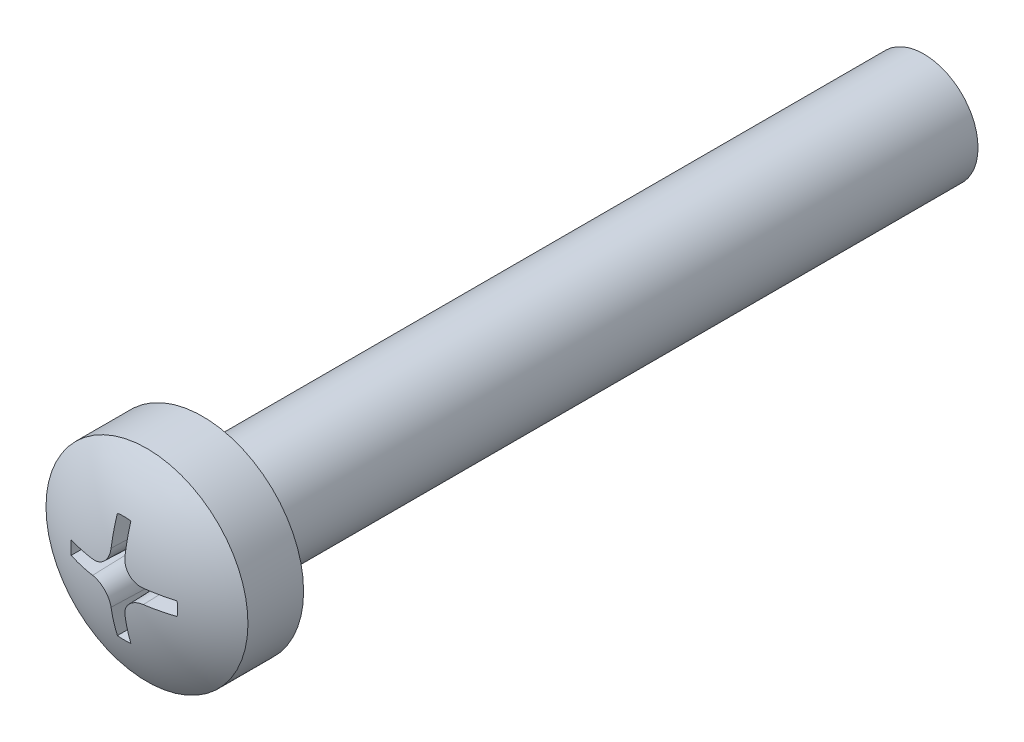
ISO-10303-21;
HEADER;
FILE_DESCRIPTION(('STEP AP214'),'2;1');
FILE_NAME('part.step','',(''),(''),'','','');
FILE_SCHEMA(('AUTOMOTIVE_DESIGN { 1 0 10303 214 1 1 1 1 }'));
ENDSEC;
DATA;
#1=APPLICATION_CONTEXT('core data for automotive mechanical design processes');
#2=APPLICATION_PROTOCOL_DEFINITION('international standard','automotive_design',2000,#1);
#3=PRODUCT_CONTEXT('',#1,'mechanical');
#4=PRODUCT('Part','Part','',(#3));
#5=PRODUCT_RELATED_PRODUCT_CATEGORY('part','',(#4));
#6=PRODUCT_DEFINITION_FORMATION('','',#4);
#7=PRODUCT_DEFINITION_CONTEXT('part definition',#1,'design');
#8=PRODUCT_DEFINITION('design','',#6,#7);
#9=PRODUCT_DEFINITION_SHAPE('','',#8);
#10=(LENGTH_UNIT() NAMED_UNIT(*) SI_UNIT(.MILLI.,.METRE.));
#11=(NAMED_UNIT(*) PLANE_ANGLE_UNIT() SI_UNIT($,.RADIAN.));
#12=(NAMED_UNIT(*) SI_UNIT($,.STERADIAN.) SOLID_ANGLE_UNIT());
#13=UNCERTAINTY_MEASURE_WITH_UNIT(LENGTH_MEASURE(1.E-05),#10,'distance_accuracy_value','');
#14=(GEOMETRIC_REPRESENTATION_CONTEXT(3) GLOBAL_UNCERTAINTY_ASSIGNED_CONTEXT((#13)) GLOBAL_UNIT_ASSIGNED_CONTEXT((#10,
#11,#12)) REPRESENTATION_CONTEXT('',''));
#15=CARTESIAN_POINT('',(0.,0.,0.));
#16=DIRECTION('',(0.,0.,1.));
#17=DIRECTION('',(1.,0.,0.));
#18=AXIS2_PLACEMENT_3D('',#15,#16,#17);
#19=CARTESIAN_POINT('',(0.,0.,20.));
#20=DIRECTION('',(0.,0.,-1.));
#21=DIRECTION('',(-1.,0.,0.));
#22=AXIS2_PLACEMENT_3D('',#19,#20,#21);
#23=CYLINDRICAL_SURFACE('',#22,1.5);
#24=CARTESIAN_POINT('',(0.,0.,20.));
#25=DIRECTION('',(0.,0.,1.));
#26=DIRECTION('',(1.,0.,0.));
#27=AXIS2_PLACEMENT_3D('',#24,#25,#26);
#28=CIRCLE('',#27,1.5);
#29=CARTESIAN_POINT('',(1.5,0.,20.));
#30=VERTEX_POINT('',#29);
#31=EDGE_CURVE('E206',#30,#30,#28,.T.);
#32=ORIENTED_EDGE('',*,*,#31,.F.);
#33=EDGE_LOOP('',(#32));
#34=FACE_BOUND('',#33,.T.);
#35=CARTESIAN_POINT('',(0.,0.,0.));
#36=DIRECTION('',(0.,0.,1.));
#37=DIRECTION('',(1.,0.,0.));
#38=AXIS2_PLACEMENT_3D('',#35,#36,#37);
#39=CIRCLE('',#38,1.5);
#40=CARTESIAN_POINT('',(1.5,0.,0.));
#41=VERTEX_POINT('',#40);
#42=EDGE_CURVE('E205',#41,#41,#39,.T.);
#43=ORIENTED_EDGE('',*,*,#42,.T.);
#44=EDGE_LOOP('',(#43));
#45=FACE_BOUND('',#44,.T.);
#46=ADVANCED_FACE('F34',(#34,#45),#23,.T.);
#47=CARTESIAN_POINT('',(0.,0.,0.));
#48=DIRECTION('',(0.,0.,1.));
#49=DIRECTION('',(1.,0.,0.));
#50=AXIS2_PLACEMENT_3D('',#47,#48,#49);
#51=PLANE('',#50);
#52=ORIENTED_EDGE('',*,*,#42,.F.);
#53=EDGE_LOOP('',(#52));
#54=FACE_BOUND('',#53,.T.);
#55=ADVANCED_FACE('F295',(#54),#51,.F.);
#56=CARTESIAN_POINT('',(0.,0.,20.));
#57=DIRECTION('',(0.,0.,-1.));
#58=DIRECTION('',(-1.,0.,0.));
#59=AXIS2_PLACEMENT_3D('',#56,#57,#58);
#60=PLANE('',#59);
#61=CARTESIAN_POINT('',(0.,0.,20.));
#62=DIRECTION('',(0.,0.,-1.));
#63=DIRECTION('',(-1.,0.,0.));
#64=AXIS2_PLACEMENT_3D('',#61,#62,#63);
#65=CIRCLE('',#64,2.79999990016222);
#66=CARTESIAN_POINT('',(-2.79999990016222,0.,20.));
#67=VERTEX_POINT('',#66);
#68=EDGE_CURVE('E202',#67,#67,#65,.T.);
#69=ORIENTED_EDGE('',*,*,#68,.T.);
#70=EDGE_LOOP('',(#69));
#71=FACE_BOUND('',#70,.T.);
#72=ORIENTED_EDGE('',*,*,#31,.T.);
#73=EDGE_LOOP('',(#72));
#74=FACE_BOUND('',#73,.T.);
#75=ADVANCED_FACE('F300',(#71,#74),#60,.T.);
#76=CARTESIAN_POINT('',(0.,0.,-0.393620134621003));
#77=DIRECTION('',(0.,0.,-1.));
#78=DIRECTION('',(-1.,0.,0.));
#79=AXIS2_PLACEMENT_3D('',#76,#77,#78);
#80=CYLINDRICAL_SURFACE('',#79,2.79999990016222);
#81=CARTESIAN_POINT('',(0.,0.,21.5424630797893));
#82=DIRECTION('',(0.,0.,-1.));
#83=DIRECTION('',(-1.,0.,0.));
#84=AXIS2_PLACEMENT_3D('',#81,#82,#83);
#85=CIRCLE('',#84,2.79999990016222);
#86=CARTESIAN_POINT('',(-2.79999990016222,0.,21.5424630797893));
#87=VERTEX_POINT('',#86);
#88=EDGE_CURVE('E150',#87,#87,#85,.T.);
#89=ORIENTED_EDGE('',*,*,#88,.T.);
#90=EDGE_LOOP('',(#89));
#91=FACE_BOUND('',#90,.T.);
#92=ORIENTED_EDGE('',*,*,#68,.F.);
#93=EDGE_LOOP('',(#92));
#94=FACE_BOUND('',#93,.T.);
#95=ADVANCED_FACE('F307',(#91,#94),#80,.T.);
#96=CARTESIAN_POINT('',(0.,0.,17.4000001117587));
#97=DIRECTION('',(0.,0.,-1.));
#98=DIRECTION('',(1.,0.,0.));
#99=AXIS2_PLACEMENT_3D('',#96,#97,#98);
#100=SPHERICAL_SURFACE('',#99,4.99999988824129);
#101=CARTESIAN_POINT('',(0.,0.,22.1754183821502));
#102=DIRECTION('',(0.,0.,-1.));
#103=DIRECTION('',(-1.,0.,0.));
#104=AXIS2_PLACEMENT_3D('',#101,#102,#103);
#105=CIRCLE('',#104,1.4816812157899);
#106=CARTESIAN_POINT('',(0.18668120666759,1.46987392394782,22.1754183821501));
#107=VERTEX_POINT('',#106);
#108=CARTESIAN_POINT('',(-0.186681206667593,1.46987392394782,22.1754183821501));
#109=VERTEX_POINT('',#108);
#110=EDGE_CURVE('E11',#107,#109,#105,.F.);
#111=ORIENTED_EDGE('',*,*,#110,.F.);
#112=CARTESIAN_POINT('',(0.0198956640512633,0.,17.3993053398605));
#113=DIRECTION('',(0.999390827019096,0.,-0.034899496702501));
#114=DIRECTION('',(-0.034899496702501,0.,-0.999390827019096));
#115=AXIS2_PLACEMENT_3D('',#112,#113,#114);
#116=CIRCLE('',#115,4.99996025606773);
#117=CARTESIAN_POINT('',(0.192632610704328,0.708178557647151,22.3458442955351));
#118=VERTEX_POINT('',#117);
#119=EDGE_CURVE('E41',#107,#118,#116,.T.);
#120=ORIENTED_EDGE('',*,*,#119,.T.);
#121=CARTESIAN_POINT('',(0.192631650862954,0.708378557647151,22.345815691475));
#122=CARTESIAN_POINT('',(0.192737639690806,0.679822741796073,22.3499041439734));
#123=CARTESIAN_POINT('',(0.195268867839181,0.651227392830895,22.3536463362414));
#124=CARTESIAN_POINT('',(0.205046889209158,0.594767038274589,22.3603460551712));
#125=CARTESIAN_POINT('',(0.212292618678018,0.566901869404939,22.3633037586285));
#126=CARTESIAN_POINT('',(0.231373694375068,0.51267267841366,22.3683466063254));
#127=CARTESIAN_POINT('',(0.24321326807329,0.486310064716558,22.3704309431667));
#128=CARTESIAN_POINT('',(0.271156607880554,0.435900324544808,22.3736603491012));
#129=CARTESIAN_POINT('',(0.287258672100205,0.411852279143785,22.3748057923214));
#130=CARTESIAN_POINT('',(0.323072075489886,0.367028886470805,22.3761158025717));
#131=CARTESIAN_POINT('',(0.342740648168189,0.346219679514824,22.3762912893596));
#132=CARTESIAN_POINT('',(0.385246757538769,0.308146709447779,22.3756853456951));
#133=CARTESIAN_POINT('',(0.408084792807393,0.29088350520688,22.3749037645383));
#134=CARTESIAN_POINT('',(0.456147210008962,0.260464262414973,22.3724133951705));
#135=CARTESIAN_POINT('',(0.481359759209806,0.247289131136678,22.3707090224733));
#136=CARTESIAN_POINT('',(0.533541444049375,0.225283958921734,22.3664258870809));
#137=CARTESIAN_POINT('',(0.560509920861878,0.216452298826715,22.3638474508254));
#138=CARTESIAN_POINT('',(0.606876295057339,0.205379627868596,22.3588207651558));
#139=CARTESIAN_POINT('',(0.626020977094075,0.201943221890058,22.3565812960749));
#140=CARTESIAN_POINT('',(0.664502044043211,0.197253494550335,22.3517582366185));
#141=CARTESIAN_POINT('',(0.683838077649067,0.195996727127303,22.349175196413));
#142=CARTESIAN_POINT('',(0.703167546290468,0.195835015722444,22.3464334662955));
#143=B_SPLINE_CURVE_WITH_KNOTS('',3,(#121,#122,#123,#124,#125,#126,#127,#128,#129,#130,#131,
#132,#133,#134,#135,#136,#137,#138,#139,#140,#141,#142),.UNSPECIFIED.,.F.,.F.,(4,2,2,2,2,2,2,2,
2,2,4),(0.,0.086441782958675,0.172864068455127,0.259366073122685,0.34583359199461,
0.43132564691208,0.516831165542018,0.601931114274005,0.686999315371812,0.745618262708563,
0.804144447281415),.UNSPECIFIED.);
#144=CARTESIAN_POINT('',(0.702917362553185,0.19583721033533,22.3464689381926));
#145=VERTEX_POINT('',#144);
#146=EDGE_CURVE('E277',#118,#145,#143,.T.);
#147=ORIENTED_EDGE('',*,*,#146,.T.);
#148=CARTESIAN_POINT('',(0.000105390153351674,0.0259265633149154,17.3990947287374));
#149=DIRECTION('',(0.00406243901494415,0.999382570249833,-0.034899496702501));
#150=DIRECTION('',(0.,0.0348997846864301,0.999390816962434));
#151=AXIS2_PLACEMENT_3D('',#148,#149,#150);
#152=CIRCLE('',#151,4.99993258603575);
#153=CARTESIAN_POINT('',(1.46986565043204,0.186746338396853,22.1754183821502));
#154=VERTEX_POINT('',#153);
#155=EDGE_CURVE('E275',#154,#145,#152,.F.);
#156=ORIENTED_EDGE('',*,*,#155,.F.);
#157=CARTESIAN_POINT('',(0.,0.,22.1754183821502));
#158=DIRECTION('',(0.,0.,-1.));
#159=DIRECTION('',(-1.,0.,0.));
#160=AXIS2_PLACEMENT_3D('',#157,#158,#159);
#161=CIRCLE('',#160,1.4816812157899);
#162=CARTESIAN_POINT('',(1.46986565043204,-0.186746338396852,22.1754183821501));
#163=VERTEX_POINT('',#162);
#164=EDGE_CURVE('E273',#163,#154,#161,.F.);
#165=ORIENTED_EDGE('',*,*,#164,.F.);
#166=CARTESIAN_POINT('',(0.000105390153351705,-0.0259265633149168,17.3990947287374));
#167=DIRECTION('',(0.00406243901494512,-0.999382570249833,-0.034899496702501));
#168=DIRECTION('',(0.,0.0348997846864301,-0.999390816962434));
#169=AXIS2_PLACEMENT_3D('',#166,#167,#168);
#170=CIRCLE('',#169,4.99993258603575);
#171=CARTESIAN_POINT('',(0.702917362553185,-0.195837210335333,22.3464689381926));
#172=VERTEX_POINT('',#171);
#173=EDGE_CURVE('E270',#163,#172,#170,.T.);
#174=ORIENTED_EDGE('',*,*,#173,.T.);
#175=CARTESIAN_POINT('',(0.192631650862954,-0.708378557647151,22.345815691475));
#176=CARTESIAN_POINT('',(0.192737639690806,-0.679822741796074,22.3499041439734));
#177=CARTESIAN_POINT('',(0.195268867839181,-0.651227392830896,22.3536463362414));
#178=CARTESIAN_POINT('',(0.205046889209158,-0.59476703827459,22.3603460551712));
#179=CARTESIAN_POINT('',(0.212292618678018,-0.56690186940494,22.3633037586285));
#180=CARTESIAN_POINT('',(0.231373694375068,-0.512672678413661,22.3683466063254));
#181=CARTESIAN_POINT('',(0.24321326807329,-0.486310064716559,22.3704309431667));
#182=CARTESIAN_POINT('',(0.271156607880554,-0.435900324544809,22.3736603491012));
#183=CARTESIAN_POINT('',(0.287258672100205,-0.411852279143786,22.3748057923214));
#184=CARTESIAN_POINT('',(0.323072075489886,-0.367028886470806,22.3761158025717));
#185=CARTESIAN_POINT('',(0.342740648168188,-0.346219679514826,22.3762912893596));
#186=CARTESIAN_POINT('',(0.385246757538768,-0.30814670944778,22.3756853456951));
#187=CARTESIAN_POINT('',(0.408084792807392,-0.290883505206882,22.3749037645383));
#188=CARTESIAN_POINT('',(0.456147210008962,-0.260464262414974,22.3724133951705));
#189=CARTESIAN_POINT('',(0.481359759209806,-0.247289131136679,22.3707090224733));
#190=CARTESIAN_POINT('',(0.533541444049374,-0.225283958921735,22.3664258870809));
#191=CARTESIAN_POINT('',(0.560509920861878,-0.216452298826716,22.3638474508254));
#192=CARTESIAN_POINT('',(0.606876295057339,-0.205379627868597,22.3588207651558));
#193=CARTESIAN_POINT('',(0.626020977094074,-0.201943221890059,22.3565812960749));
#194=CARTESIAN_POINT('',(0.66450204404321,-0.197253494550336,22.3517582366185));
#195=CARTESIAN_POINT('',(0.683838077649067,-0.195996727127304,22.349175196413));
#196=CARTESIAN_POINT('',(0.703167546290468,-0.195835015722445,22.3464334662955));
#197=B_SPLINE_CURVE_WITH_KNOTS('',3,(#175,#176,#177,#178,#179,#180,#181,#182,#183,#184,#185,
#186,#187,#188,#189,#190,#191,#192,#193,#194,#195,#196),.UNSPECIFIED.,.F.,.F.,(4,2,2,2,2,2,2,2,
2,2,4),(0.,0.0864417829586748,0.172864068455127,0.259366073122684,0.34583359199461,
0.43132564691208,0.516831165542017,0.601931114274005,0.686999315371811,0.745618262708562,
0.804144447281415),.UNSPECIFIED.);
#198=CARTESIAN_POINT('',(0.192632610704328,-0.708178557647152,22.3458442955351));
#199=VERTEX_POINT('',#198);
#200=EDGE_CURVE('E264',#199,#172,#197,.T.);
#201=ORIENTED_EDGE('',*,*,#200,.F.);
#202=CARTESIAN_POINT('',(0.0198956640512633,0.,17.3993053398605));
#203=DIRECTION('',(0.999390827019096,0.,-0.034899496702501));
#204=DIRECTION('',(-0.034899496702501,0.,-0.999390827019096));
#205=AXIS2_PLACEMENT_3D('',#202,#203,#204);
#206=CIRCLE('',#205,4.99996025606773);
#207=CARTESIAN_POINT('',(0.186681206667591,-1.46987392394782,22.1754183821502));
#208=VERTEX_POINT('',#207);
#209=EDGE_CURVE('E262',#208,#199,#206,.F.);
#210=ORIENTED_EDGE('',*,*,#209,.F.);
#211=CARTESIAN_POINT('',(0.,0.,22.1754183821502));
#212=DIRECTION('',(0.,0.,-1.));
#213=DIRECTION('',(-1.,0.,0.));
#214=AXIS2_PLACEMENT_3D('',#211,#212,#213);
#215=CIRCLE('',#214,1.4816812157899);
#216=CARTESIAN_POINT('',(-0.186681206667593,-1.46987392394782,22.1754183821501));
#217=VERTEX_POINT('',#216);
#218=EDGE_CURVE('E259',#208,#217,#215,.T.);
#219=ORIENTED_EDGE('',*,*,#218,.T.);
#220=CARTESIAN_POINT('',(-0.0198956640512654,0.,17.3993053398605));
#221=DIRECTION('',(-0.999390827019096,0.,-0.034899496702501));
#222=DIRECTION('',(-0.034899496702501,0.,0.999390827019096));
#223=AXIS2_PLACEMENT_3D('',#220,#221,#222);
#224=CIRCLE('',#223,4.99996025606773);
#225=CARTESIAN_POINT('',(-0.19263261070433,-0.708178557647151,22.3458442955351));
#226=VERTEX_POINT('',#225);
#227=EDGE_CURVE('E255',#217,#226,#224,.T.);
#228=ORIENTED_EDGE('',*,*,#227,.T.);
#229=CARTESIAN_POINT('',(-0.70316754629047,-0.195835015722445,22.3464334662955));
#230=CARTESIAN_POINT('',(-0.674619447950853,-0.196052963217916,22.3504857241647));
#231=CARTESIAN_POINT('',(-0.646041434637229,-0.198695168407334,22.3541890416191));
#232=CARTESIAN_POINT('',(-0.589634494727846,-0.208689654905481,22.3608068014756));
#233=CARTESIAN_POINT('',(-0.561805393198953,-0.216040826152062,22.3637214295682));
#234=CARTESIAN_POINT('',(-0.507666120821231,-0.235323893103951,22.3686750861046));
#235=CARTESIAN_POINT('',(-0.481357369172765,-0.247259991703852,22.370713307523));
#236=CARTESIAN_POINT('',(-0.431071022991569,-0.275383990623326,22.3738489099634));
#237=CARTESIAN_POINT('',(-0.407092510169896,-0.291570206692358,22.3749466629444));
#238=CARTESIAN_POINT('',(-0.362416703115868,-0.327538701485094,22.3761618083202));
#239=CARTESIAN_POINT('',(-0.341685887352751,-0.347278991317758,22.376289966384));
#240=CARTESIAN_POINT('',(-0.303780328011578,-0.389912448398921,22.375590364716));
#241=CARTESIAN_POINT('',(-0.286606147147997,-0.412806113607387,22.3747624538554));
#242=CARTESIAN_POINT('',(-0.256366858084051,-0.460969475916928,22.3721816258056));
#243=CARTESIAN_POINT('',(-0.243283863198687,-0.486228184526671,22.3704328274806));
#244=CARTESIAN_POINT('',(-0.22146899790456,-0.538485231439467,22.366063898297));
#245=CARTESIAN_POINT('',(-0.212735526227358,-0.565482925398503,22.3634440886927));
#246=CARTESIAN_POINT('',(-0.201823996880683,-0.611913615273529,22.3583478129874));
#247=CARTESIAN_POINT('',(-0.198453223120025,-0.631098599357624,22.3560784464194));
#248=CARTESIAN_POINT('',(-0.193901764340931,-0.669652448873598,22.3511968730386));
#249=CARTESIAN_POINT('',(-0.192717622166764,-0.689020975292662,22.3485852144187));
#250=CARTESIAN_POINT('',(-0.192631650862956,-0.708378557647151,22.345815691475));
#251=B_SPLINE_CURVE_WITH_KNOTS('',3,(#229,#230,#231,#232,#233,#234,#235,#236,#237,#238,#239,
#240,#241,#242,#243,#244,#245,#246,#247,#248,#249,#250),.UNSPECIFIED.,.F.,.F.,(4,2,2,2,2,2,2,2,
2,2,4),(0.,0.0864053436114192,0.172790326060609,0.259254685287908,0.345684831711329,
0.431153892876566,0.516636466251359,0.601739908197795,0.686811996276176,0.745524819849981,
0.804144736260156),.UNSPECIFIED.);
#252=CARTESIAN_POINT('',(-0.702917362553187,-0.195837210335331,22.3464689381926));
#253=VERTEX_POINT('',#252);
#254=EDGE_CURVE('E248',#253,#226,#251,.T.);
#255=ORIENTED_EDGE('',*,*,#254,.F.);
#256=CARTESIAN_POINT('',(-0.000105390153348331,-0.0259265633149167,17.3990947287374));
#257=DIRECTION('',(-0.0040624390149453,-0.999382570249833,-0.034899496702501));
#258=DIRECTION('',(0.,0.0348997846864301,-0.999390816962434));
#259=AXIS2_PLACEMENT_3D('',#256,#257,#258);
#260=CIRCLE('',#259,4.99993258603575);
#261=CARTESIAN_POINT('',(-1.46986565043204,-0.186746338396853,22.1754183821502));
#262=VERTEX_POINT('',#261);
#263=EDGE_CURVE('E256',#262,#253,#260,.F.);
#264=ORIENTED_EDGE('',*,*,#263,.F.);
#265=CARTESIAN_POINT('',(0.,0.,22.1754183821502));
#266=DIRECTION('',(0.,0.,-1.));
#267=DIRECTION('',(-1.,0.,0.));
#268=AXIS2_PLACEMENT_3D('',#265,#266,#267);
#269=CIRCLE('',#268,1.4816812157899);
#270=CARTESIAN_POINT('',(-1.46986565043204,0.186746338396852,22.1754183821501));
#271=VERTEX_POINT('',#270);
#272=EDGE_CURVE('E594',#262,#271,#269,.T.);
#273=ORIENTED_EDGE('',*,*,#272,.T.);
#274=CARTESIAN_POINT('',(-0.000105390153348331,0.0259265633149167,17.3990947287374));
#275=DIRECTION('',(-0.00406243901494529,0.999382570249833,-0.034899496702501));
#276=DIRECTION('',(0.,0.0348997846864301,0.999390816962434));
#277=AXIS2_PLACEMENT_3D('',#274,#275,#276);
#278=CIRCLE('',#277,4.99993258603575);
#279=CARTESIAN_POINT('',(-0.702917362553187,0.195837210335332,22.3464689381926));
#280=VERTEX_POINT('',#279);
#281=EDGE_CURVE('E221',#271,#280,#278,.T.);
#282=ORIENTED_EDGE('',*,*,#281,.T.);
#283=CARTESIAN_POINT('',(-0.192631650862955,0.708378557647151,22.345815691475));
#284=CARTESIAN_POINT('',(-0.192737639690808,0.679822741796073,22.3499041439734));
#285=CARTESIAN_POINT('',(-0.195268867839183,0.651227392830895,22.3536463362414));
#286=CARTESIAN_POINT('',(-0.20504688920916,0.594767038274589,22.3603460551712));
#287=CARTESIAN_POINT('',(-0.21229261867802,0.566901869404939,22.3633037586285));
#288=CARTESIAN_POINT('',(-0.23137369437507,0.51267267841366,22.3683466063254));
#289=CARTESIAN_POINT('',(-0.243213268073292,0.486310064716558,22.3704309431667));
#290=CARTESIAN_POINT('',(-0.271156607880556,0.435900324544808,22.3736603491012));
#291=CARTESIAN_POINT('',(-0.287258672100207,0.411852279143785,22.3748057923214));
#292=CARTESIAN_POINT('',(-0.323072075489888,0.367028886470805,22.3761158025717));
#293=CARTESIAN_POINT('',(-0.34274064816819,0.346219679514825,22.3762912893596));
#294=CARTESIAN_POINT('',(-0.38524675753877,0.30814670944778,22.3756853456951));
#295=CARTESIAN_POINT('',(-0.408084792807394,0.290883505206881,22.3749037645383));
#296=CARTESIAN_POINT('',(-0.456147210008964,0.260464262414973,22.3724133951705));
#297=CARTESIAN_POINT('',(-0.481359759209807,0.247289131136679,22.3707090224733));
#298=CARTESIAN_POINT('',(-0.533541444049376,0.225283958921734,22.3664258870809));
#299=CARTESIAN_POINT('',(-0.56050992086188,0.216452298826715,22.3638474508254));
#300=CARTESIAN_POINT('',(-0.606876295057341,0.205379627868597,22.3588207651558));
#301=CARTESIAN_POINT('',(-0.626020977094076,0.201943221890059,22.3565812960749));
#302=CARTESIAN_POINT('',(-0.664502044043212,0.197253494550336,22.3517582366185));
#303=CARTESIAN_POINT('',(-0.683838077649069,0.195996727127304,22.349175196413));
#304=CARTESIAN_POINT('',(-0.703167546290469,0.195835015722445,22.3464334662955));
#305=B_SPLINE_CURVE_WITH_KNOTS('',3,(#283,#284,#285,#286,#287,#288,#289,#290,#291,#292,#293,
#294,#295,#296,#297,#298,#299,#300,#301,#302,#303,#304),.UNSPECIFIED.,.F.,.F.,(4,2,2,2,2,2,2,2,
2,2,4),(0.,0.0864417829586747,0.172864068455127,0.259366073122685,0.34583359199461,
0.43132564691208,0.516831165542017,0.601931114274005,0.686999315371811,0.745618262708562,
0.804144447281415),.UNSPECIFIED.);
#306=CARTESIAN_POINT('',(-0.19263261070433,0.708178557647151,22.3458442955351));
#307=VERTEX_POINT('',#306);
#308=EDGE_CURVE('E213',#307,#280,#305,.T.);
#309=ORIENTED_EDGE('',*,*,#308,.F.);
#310=CARTESIAN_POINT('',(-0.0198956640512643,0.,17.3993053398605));
#311=DIRECTION('',(-0.999390827019096,0.,-0.034899496702501));
#312=DIRECTION('',(-0.034899496702501,0.,0.999390827019096));
#313=AXIS2_PLACEMENT_3D('',#310,#311,#312);
#314=CIRCLE('',#313,4.99996025606773);
#315=EDGE_CURVE('E209',#109,#307,#314,.F.);
#316=ORIENTED_EDGE('',*,*,#315,.F.);
#317=EDGE_LOOP('',(#111,#120,#147,#156,#165,#174,#201,#210,#219,#228,#255,#264,#273,#282,#309,#316));
#318=FACE_BOUND('',#317,.T.);
#319=ORIENTED_EDGE('',*,*,#88,.F.);
#320=EDGE_LOOP('',(#319));
#321=FACE_BOUND('',#320,.T.);
#322=ADVANCED_FACE('F223',(#318,#321),#100,.T.);
#323=CARTESIAN_POINT('',(0.,0.,22.7000001));
#324=DIRECTION('',(0.,0.,1.));
#325=DIRECTION('',(1.,0.,0.));
#326=AXIS2_PLACEMENT_3D('',#323,#324,#325);
#327=CONICAL_SURFACE('',#326,1.50000001303852,0.0349065850398867);
#328=ORIENTED_EDGE('',*,*,#110,.T.);
#329=CARTESIAN_POINT('',(-0.142142619910814,1.43009594495933,20.9000001309199));
#330=CARTESIAN_POINT('',(-0.152618658076336,1.43957885994155,21.1999946132293));
#331=CARTESIAN_POINT('',(-0.163094792502732,1.4489727928664,21.4999918520894));
#332=CARTESIAN_POINT('',(-0.184047253837866,1.46758269456637,22.0999918417828));
#333=CARTESIAN_POINT('',(-0.194523580746602,1.47679866334215,22.399994592616));
#334=CARTESIAN_POINT('',(-0.205000003916213,1.48592565006124,22.7000001));
#335=B_SPLINE_CURVE_WITH_KNOTS('',3,(#329,#330,#331,#332,#333,#334),.UNSPECIFIED.,.F.,.F.,(4,2,
4),(0.,0.900981158642232,1.80196231389533),.UNSPECIFIED.);
#336=CARTESIAN_POINT('',(-0.142142619910814,1.43009594495933,20.9000001309199));
#337=VERTEX_POINT('',#336);
#338=EDGE_CURVE('E48',#337,#109,#335,.T.);
#339=ORIENTED_EDGE('',*,*,#338,.F.);
#340=CARTESIAN_POINT('',(0.,0.,20.9000001309199));
#341=DIRECTION('',(0.,0.,1.));
#342=DIRECTION('',(1.,0.,0.));
#343=AXIS2_PLACEMENT_3D('',#340,#341,#342);
#344=CIRCLE('',#343,1.43714262903312);
#345=CARTESIAN_POINT('',(0.142142619910811,1.43009594495933,20.9000001309199));
#346=VERTEX_POINT('',#345);
#347=EDGE_CURVE('E158',#346,#337,#344,.T.);
#348=ORIENTED_EDGE('',*,*,#347,.F.);
#349=CARTESIAN_POINT('',(0.142142619910811,1.43009594495933,20.9000001309199));
#350=CARTESIAN_POINT('',(0.152618658076333,1.43957885994155,21.1999946132293));
#351=CARTESIAN_POINT('',(0.16309479250273,1.4489727928664,21.4999918520894));
#352=CARTESIAN_POINT('',(0.184047253837863,1.46758269456637,22.0999918417828));
#353=CARTESIAN_POINT('',(0.1945235807466,1.47679866334215,22.399994592616));
#354=CARTESIAN_POINT('',(0.205000003916211,1.48592565006124,22.7000001));
#355=B_SPLINE_CURVE_WITH_KNOTS('',3,(#349,#350,#351,#352,#353,#354),.UNSPECIFIED.,.F.,.F.,(4,2,
4),(0.,0.900981158642232,1.80196231389533),.UNSPECIFIED.);
#356=EDGE_CURVE('E142',#346,#107,#355,.T.);
#357=ORIENTED_EDGE('',*,*,#356,.T.);
#358=EDGE_LOOP('',(#328,#339,#348,#357));
#359=FACE_BOUND('',#358,.T.);
#360=ADVANCED_FACE('F162',(#359),#327,.F.);
#361=CARTESIAN_POINT('',(0.205000003916211,1.48592565006124,22.7000001));
#362=DIRECTION('',(0.999390827019096,0.,-0.034899496702501));
#363=DIRECTION('',(-0.034899496702501,0.,-0.999390827019096));
#364=AXIS2_PLACEMENT_3D('',#361,#362,#363);
#365=PLANE('',#364);
#366=ORIENTED_EDGE('',*,*,#356,.F.);
#367=DIRECTION('',(0.,1.,0.));
#368=VECTOR('',#367,1.);
#369=CARTESIAN_POINT('',(0.142142619910812,0.,20.9000001309199));
#370=LINE('',#369,#368);
#371=CARTESIAN_POINT('',(0.142142619910811,0.708178557647151,20.9000001309199));
#372=VERTEX_POINT('',#371);
#373=EDGE_CURVE('E145',#346,#372,#370,.F.);
#374=ORIENTED_EDGE('',*,*,#373,.T.);
#375=DIRECTION('',(0.034899496702501,0.,0.999390827019096));
#376=VECTOR('',#375,1.);
#377=CARTESIAN_POINT('',(0.20500000391621,0.708178557647151,22.7000001));
#378=LINE('',#377,#376);
#379=EDGE_CURVE('E151',#372,#118,#378,.T.);
#380=ORIENTED_EDGE('',*,*,#379,.T.);
#381=ORIENTED_EDGE('',*,*,#119,.F.);
#382=EDGE_LOOP('',(#366,#374,#380,#381));
#383=FACE_BOUND('',#382,.T.);
#384=ADVANCED_FACE('F144',(#383),#365,.F.);
#385=CARTESIAN_POINT('',(0.705000003916211,0.708178557647151,22.7000001));
#386=DIRECTION('',(0.,0.,-1.));
#387=DIRECTION('',(1.,0.,0.));
#388=AXIS2_PLACEMENT_3D('',#385,#386,#387);
#389=CONICAL_SURFACE('',#388,0.5,0.0349065850398867);
#390=ORIENTED_EDGE('',*,*,#379,.F.);
#391=CARTESIAN_POINT('',(0.705000003916211,0.708178557647151,20.9000001309199));
#392=DIRECTION('',(0.,0.,1.));
#393=DIRECTION('',(1.,0.,0.));
#394=AXIS2_PLACEMENT_3D('',#391,#392,#393);
#395=CIRCLE('',#394,0.562857384005399);
#396=CARTESIAN_POINT('',(0.702712036351556,0.145325823858085,20.9000001309199));
#397=VERTEX_POINT('',#396);
#398=EDGE_CURVE('E160',#372,#397,#395,.T.);
#399=ORIENTED_EDGE('',*,*,#398,.T.);
#400=DIRECTION('',(0.000141863496415148,0.0348992083697649,0.999390827019096));
#401=VECTOR('',#400,1.);
#402=CARTESIAN_POINT('',(0.702967546290468,0.208182688548215,22.7000001));
#403=LINE('',#402,#401);
#404=EDGE_CURVE('E420',#397,#145,#403,.T.);
#405=ORIENTED_EDGE('',*,*,#404,.T.);
#406=ORIENTED_EDGE('',*,*,#146,.F.);
#407=EDGE_LOOP('',(#390,#399,#405,#406));
#408=FACE_BOUND('',#407,.T.);
#409=ADVANCED_FACE('F283',(#408),#389,.T.);
#410=CARTESIAN_POINT('',(1.48592565006123,0.205000003916213,22.7000001));
#411=DIRECTION('',(0.00406243901494415,0.999382570249833,-0.034899496702501));
#412=DIRECTION('',(0.,0.0348997846864301,0.999390816962434));
#413=AXIS2_PLACEMENT_3D('',#410,#411,#412);
#414=PLANE('',#413);
#415=ORIENTED_EDGE('',*,*,#155,.T.);
#416=ORIENTED_EDGE('',*,*,#404,.F.);
#417=DIRECTION('',(-0.99999173819787,0.00406491525148502,0.));
#418=VECTOR('',#417,1.);
#419=CARTESIAN_POINT('',(0.000602343564913371,0.148179863836023,20.9000001309199));
#420=LINE('',#419,#418);
#421=CARTESIAN_POINT('',(1.43007341244828,0.142369137079488,20.9000001309199));
#422=VERTEX_POINT('',#421);
#423=EDGE_CURVE('E171',#422,#397,#420,.T.);
#424=ORIENTED_EDGE('',*,*,#423,.F.);
#425=CARTESIAN_POINT('',(1.43007341244828,0.142369137079488,20.9000001309199));
#426=CARTESIAN_POINT('',(1.43955869120937,0.152806706922151,21.1999946790441));
#427=CARTESIAN_POINT('',(1.44895568373278,0.163244730756208,21.4999919508073));
#428=CARTESIAN_POINT('',(1.46757309626977,0.184121686368453,22.0999919405007));
#429=CARTESIAN_POINT('',(1.47679351628402,0.194560618146638,22.3999946584309));
#430=CARTESIAN_POINT('',(1.48592565006123,0.205000003916213,22.7000001));
#431=B_SPLINE_CURVE_WITH_KNOTS('',3,(#425,#426,#427,#428,#429,#430),.UNSPECIFIED.,.F.,.F.,(4,2,
4),(0.,0.900977563471273,1.80195512360615),.UNSPECIFIED.);
#432=EDGE_CURVE('E414',#422,#154,#431,.T.);
#433=ORIENTED_EDGE('',*,*,#432,.T.);
#434=EDGE_LOOP('',(#415,#416,#424,#433));
#435=FACE_BOUND('',#434,.T.);
#436=ADVANCED_FACE('F235',(#435),#414,.F.);
#437=CARTESIAN_POINT('',(0.,0.,22.7000001));
#438=DIRECTION('',(0.,0.,1.));
#439=DIRECTION('',(1.,0.,0.));
#440=AXIS2_PLACEMENT_3D('',#437,#438,#439);
#441=CONICAL_SURFACE('',#440,1.50000001303852,0.0349065850398867);
#442=ORIENTED_EDGE('',*,*,#164,.T.);
#443=ORIENTED_EDGE('',*,*,#432,.F.);
#444=CARTESIAN_POINT('',(0.,0.,20.9000001309199));
#445=DIRECTION('',(0.,0.,1.));
#446=DIRECTION('',(1.,0.,0.));
#447=AXIS2_PLACEMENT_3D('',#444,#445,#446);
#448=CIRCLE('',#447,1.43714262903312);
#449=CARTESIAN_POINT('',(1.43007341244828,-0.142369137079488,20.9000001309199));
#450=VERTEX_POINT('',#449);
#451=EDGE_CURVE('E173',#450,#422,#448,.T.);
#452=ORIENTED_EDGE('',*,*,#451,.F.);
#453=CARTESIAN_POINT('',(1.43007341244828,-0.142369137079488,20.9000001309199));
#454=CARTESIAN_POINT('',(1.43955869120937,-0.152806706922151,21.1999946790441));
#455=CARTESIAN_POINT('',(1.44895568373278,-0.163244730756208,21.4999919508073));
#456=CARTESIAN_POINT('',(1.46757309626977,-0.184121686368453,22.0999919405007));
#457=CARTESIAN_POINT('',(1.47679351628402,-0.194560618146638,22.3999946584309));
#458=CARTESIAN_POINT('',(1.48592565006123,-0.205000003916213,22.7000001));
#459=B_SPLINE_CURVE_WITH_KNOTS('',3,(#453,#454,#455,#456,#457,#458),.UNSPECIFIED.,.F.,.F.,(4,2,
4),(0.,0.900977563471273,1.80195512360615),.UNSPECIFIED.);
#460=EDGE_CURVE('E408',#450,#163,#459,.T.);
#461=ORIENTED_EDGE('',*,*,#460,.T.);
#462=EDGE_LOOP('',(#442,#443,#452,#461));
#463=FACE_BOUND('',#462,.T.);
#464=ADVANCED_FACE('F291',(#463),#441,.F.);
#465=CARTESIAN_POINT('',(1.48592565006123,-0.205000003916213,22.7000001));
#466=DIRECTION('',(0.00406243901494512,-0.999382570249833,-0.034899496702501));
#467=DIRECTION('',(0.,0.0348997846864301,-0.999390816962434));
#468=AXIS2_PLACEMENT_3D('',#465,#466,#467);
#469=PLANE('',#468);
#470=ORIENTED_EDGE('',*,*,#460,.F.);
#471=DIRECTION('',(0.99999173819787,0.00406491525148599,0.));
#472=VECTOR('',#471,1.);
#473=CARTESIAN_POINT('',(0.00060234356491352,-0.148179863836024,20.9000001309199));
#474=LINE('',#473,#472);
#475=CARTESIAN_POINT('',(0.702712036351556,-0.145325823858086,20.9000001309199));
#476=VERTEX_POINT('',#475);
#477=EDGE_CURVE('E176',#450,#476,#474,.F.);
#478=ORIENTED_EDGE('',*,*,#477,.T.);
#479=DIRECTION('',(0.000141863496415188,-0.0348992083697649,0.999390827019096));
#480=VECTOR('',#479,1.);
#481=CARTESIAN_POINT('',(0.702967546290468,-0.208182688548216,22.7000001));
#482=LINE('',#481,#480);
#483=EDGE_CURVE('E430',#476,#172,#482,.T.);
#484=ORIENTED_EDGE('',*,*,#483,.T.);
#485=ORIENTED_EDGE('',*,*,#173,.F.);
#486=EDGE_LOOP('',(#470,#478,#484,#485));
#487=FACE_BOUND('',#486,.T.);
#488=ADVANCED_FACE('F403',(#487),#469,.F.);
#489=CARTESIAN_POINT('',(0.705000003916211,-0.708178557647152,22.7000001));
#490=DIRECTION('',(0.,0.,-1.));
#491=DIRECTION('',(-1.,0.,0.));
#492=AXIS2_PLACEMENT_3D('',#489,#490,#491);
#493=CONICAL_SURFACE('',#492,0.5,0.0349065850398867);
#494=ORIENTED_EDGE('',*,*,#200,.T.);
#495=ORIENTED_EDGE('',*,*,#483,.F.);
#496=CARTESIAN_POINT('',(0.705000003916211,-0.708178557647152,20.9000001309199));
#497=DIRECTION('',(0.,0.,1.));
#498=DIRECTION('',(1.,0.,0.));
#499=AXIS2_PLACEMENT_3D('',#496,#497,#498);
#500=CIRCLE('',#499,0.562857384005399);
#501=CARTESIAN_POINT('',(0.142142619910812,-0.708178557647152,20.9000001309199));
#502=VERTEX_POINT('',#501);
#503=EDGE_CURVE('E178',#502,#476,#500,.F.);
#504=ORIENTED_EDGE('',*,*,#503,.F.);
#505=DIRECTION('',(0.034899496702501,0.,0.999390827019096));
#506=VECTOR('',#505,1.);
#507=CARTESIAN_POINT('',(0.205000003916211,-0.708178557647152,22.7000001));
#508=LINE('',#507,#506);
#509=EDGE_CURVE('E394',#502,#199,#508,.T.);
#510=ORIENTED_EDGE('',*,*,#509,.T.);
#511=EDGE_LOOP('',(#494,#495,#504,#510));
#512=FACE_BOUND('',#511,.T.);
#513=ADVANCED_FACE('F245',(#512),#493,.T.);
#514=CARTESIAN_POINT('',(0.205000003916211,-1.48592565006124,22.7000001));
#515=DIRECTION('',(0.999390827019096,0.,-0.034899496702501));
#516=DIRECTION('',(-0.034899496702501,0.,-0.999390827019096));
#517=AXIS2_PLACEMENT_3D('',#514,#515,#516);
#518=PLANE('',#517);
#519=ORIENTED_EDGE('',*,*,#209,.T.);
#520=ORIENTED_EDGE('',*,*,#509,.F.);
#521=DIRECTION('',(0.,1.,0.));
#522=VECTOR('',#521,1.);
#523=CARTESIAN_POINT('',(0.142142619910812,0.,20.9000001309199));
#524=LINE('',#523,#522);
#525=CARTESIAN_POINT('',(0.142142619910811,-1.43009594495933,20.9000001309199));
#526=VERTEX_POINT('',#525);
#527=EDGE_CURVE('E181',#526,#502,#524,.T.);
#528=ORIENTED_EDGE('',*,*,#527,.F.);
#529=CARTESIAN_POINT('',(0.142142619910811,-1.43009594495933,20.9000001309199));
#530=CARTESIAN_POINT('',(0.152618658076333,-1.43957885994155,21.1999946132293));
#531=CARTESIAN_POINT('',(0.16309479250273,-1.4489727928664,21.4999918520894));
#532=CARTESIAN_POINT('',(0.184047253837863,-1.46758269456637,22.0999918417828));
#533=CARTESIAN_POINT('',(0.1945235807466,-1.47679866334215,22.399994592616));
#534=CARTESIAN_POINT('',(0.205000003916211,-1.48592565006124,22.7000001));
#535=B_SPLINE_CURVE_WITH_KNOTS('',3,(#529,#530,#531,#532,#533,#534),.UNSPECIFIED.,.F.,.F.,(4,2,
4),(0.,0.900981158642232,1.80196231389533),.UNSPECIFIED.);
#536=EDGE_CURVE('E386',#526,#208,#535,.T.);
#537=ORIENTED_EDGE('',*,*,#536,.T.);
#538=EDGE_LOOP('',(#519,#520,#528,#537));
#539=FACE_BOUND('',#538,.T.);
#540=ADVANCED_FACE('F396',(#539),#518,.F.);
#541=CARTESIAN_POINT('',(0.,0.,22.7000001));
#542=DIRECTION('',(0.,0.,1.));
#543=DIRECTION('',(-1.,0.,0.));
#544=AXIS2_PLACEMENT_3D('',#541,#542,#543);
#545=CONICAL_SURFACE('',#544,1.50000001303852,0.0349065850398867);
#546=ORIENTED_EDGE('',*,*,#536,.F.);
#547=CARTESIAN_POINT('',(0.,0.,20.9000001309199));
#548=DIRECTION('',(0.,0.,1.));
#549=DIRECTION('',(1.,0.,0.));
#550=AXIS2_PLACEMENT_3D('',#547,#548,#549);
#551=CIRCLE('',#550,1.43714262903312);
#552=CARTESIAN_POINT('',(-0.142142619910814,-1.43009594495933,20.9000001309199));
#553=VERTEX_POINT('',#552);
#554=EDGE_CURVE('E184',#526,#553,#551,.F.);
#555=ORIENTED_EDGE('',*,*,#554,.T.);
#556=CARTESIAN_POINT('',(-0.142142619910814,-1.43009594495933,20.9000001309199));
#557=CARTESIAN_POINT('',(-0.152618658076336,-1.43957885994155,21.1999946132293));
#558=CARTESIAN_POINT('',(-0.163094792502732,-1.4489727928664,21.4999918520894));
#559=CARTESIAN_POINT('',(-0.184047253837866,-1.46758269456637,22.0999918417828));
#560=CARTESIAN_POINT('',(-0.194523580746602,-1.47679866334215,22.399994592616));
#561=CARTESIAN_POINT('',(-0.205000003916213,-1.48592565006124,22.7000001));
#562=B_SPLINE_CURVE_WITH_KNOTS('',3,(#556,#557,#558,#559,#560,#561),.UNSPECIFIED.,.F.,.F.,(4,2,
4),(0.,0.900981158642232,1.80196231389533),.UNSPECIFIED.);
#563=EDGE_CURVE('E378',#553,#217,#562,.T.);
#564=ORIENTED_EDGE('',*,*,#563,.T.);
#565=ORIENTED_EDGE('',*,*,#218,.F.);
#566=EDGE_LOOP('',(#546,#555,#564,#565));
#567=FACE_BOUND('',#566,.T.);
#568=ADVANCED_FACE('F373',(#567),#545,.F.);
#569=CARTESIAN_POINT('',(-0.205000003916213,-1.48592565006124,22.7000001));
#570=DIRECTION('',(-0.999390827019096,0.,-0.034899496702501));
#571=DIRECTION('',(-0.034899496702501,0.,0.999390827019096));
#572=AXIS2_PLACEMENT_3D('',#569,#570,#571);
#573=PLANE('',#572);
#574=ORIENTED_EDGE('',*,*,#563,.F.);
#575=DIRECTION('',(0.,-1.,0.));
#576=VECTOR('',#575,1.);
#577=CARTESIAN_POINT('',(-0.142142619910814,0.,20.9000001309199));
#578=LINE('',#577,#576);
#579=CARTESIAN_POINT('',(-0.142142619910814,-0.708178557647151,20.9000001309199));
#580=VERTEX_POINT('',#579);
#581=EDGE_CURVE('E186',#553,#580,#578,.F.);
#582=ORIENTED_EDGE('',*,*,#581,.T.);
#583=DIRECTION('',(-0.034899496702501,0.,0.999390827019096));
#584=VECTOR('',#583,1.);
#585=CARTESIAN_POINT('',(-0.205000003916213,-0.708178557647151,22.7000001));
#586=LINE('',#585,#584);
#587=EDGE_CURVE('E387',#580,#226,#586,.T.);
#588=ORIENTED_EDGE('',*,*,#587,.T.);
#589=ORIENTED_EDGE('',*,*,#227,.F.);
#590=EDGE_LOOP('',(#574,#582,#588,#589));
#591=FACE_BOUND('',#590,.T.);
#592=ADVANCED_FACE('F243',(#591),#573,.F.);
#593=CARTESIAN_POINT('',(-0.705000003916213,-0.708178557647151,22.7000001));
#594=DIRECTION('',(0.,0.,-1.));
#595=DIRECTION('',(-1.,0.,0.));
#596=AXIS2_PLACEMENT_3D('',#593,#594,#595);
#597=CONICAL_SURFACE('',#596,0.5,0.0349065850398867);
#598=ORIENTED_EDGE('',*,*,#254,.T.);
#599=ORIENTED_EDGE('',*,*,#587,.F.);
#600=CARTESIAN_POINT('',(-0.705000003916213,-0.708178557647151,20.9000001309199));
#601=DIRECTION('',(0.,0.,1.));
#602=DIRECTION('',(1.,0.,0.));
#603=AXIS2_PLACEMENT_3D('',#600,#601,#602);
#604=CIRCLE('',#603,0.562857384005399);
#605=CARTESIAN_POINT('',(-0.702712036351558,-0.145325823858086,20.9000001309199));
#606=VERTEX_POINT('',#605);
#607=EDGE_CURVE('E188',#606,#580,#604,.F.);
#608=ORIENTED_EDGE('',*,*,#607,.F.);
#609=DIRECTION('',(-0.000141863496415188,-0.0348992083697649,0.999390827019096));
#610=VECTOR('',#609,1.);
#611=CARTESIAN_POINT('',(-0.70296754629047,-0.208182688548216,22.7000001));
#612=LINE('',#611,#610);
#613=EDGE_CURVE('E586',#606,#253,#612,.T.);
#614=ORIENTED_EDGE('',*,*,#613,.T.);
#615=EDGE_LOOP('',(#598,#599,#608,#614));
#616=FACE_BOUND('',#615,.T.);
#617=ADVANCED_FACE('F238',(#616),#597,.T.);
#618=CARTESIAN_POINT('',(-1.48592565006124,-0.205000003916213,22.7000001));
#619=DIRECTION('',(-0.0040624390149453,-0.999382570249833,-0.034899496702501));
#620=DIRECTION('',(0.,0.0348997846864301,-0.999390816962434));
#621=AXIS2_PLACEMENT_3D('',#618,#619,#620);
#622=PLANE('',#621);
#623=ORIENTED_EDGE('',*,*,#263,.T.);
#624=ORIENTED_EDGE('',*,*,#613,.F.);
#625=DIRECTION('',(0.99999173819787,-0.00406491525148617,0.));
#626=VECTOR('',#625,1.);
#627=CARTESIAN_POINT('',(-0.000602343564913546,-0.148179863836024,20.9000001309199));
#628=LINE('',#627,#626);
#629=CARTESIAN_POINT('',(-1.43007341244828,-0.142369137079487,20.9000001309199));
#630=VERTEX_POINT('',#629);
#631=EDGE_CURVE('E191',#630,#606,#628,.T.);
#632=ORIENTED_EDGE('',*,*,#631,.F.);
#633=CARTESIAN_POINT('',(-1.43007341244828,-0.142369137079487,20.9000001309199));
#634=CARTESIAN_POINT('',(-1.43955869120937,-0.152806706922151,21.1999946790441));
#635=CARTESIAN_POINT('',(-1.44895568373278,-0.163244730756207,21.4999919508073));
#636=CARTESIAN_POINT('',(-1.46757309626978,-0.184121686368453,22.0999919405007));
#637=CARTESIAN_POINT('',(-1.47679351628402,-0.194560618146638,22.3999946584309));
#638=CARTESIAN_POINT('',(-1.48592565006124,-0.205000003916213,22.7000001));
#639=B_SPLINE_CURVE_WITH_KNOTS('',3,(#633,#634,#635,#636,#637,#638),.UNSPECIFIED.,.F.,.F.,(4,2,
4),(0.,0.900977563471273,1.80195512360615),.UNSPECIFIED.);
#640=EDGE_CURVE('E353',#630,#262,#639,.T.);
#641=ORIENTED_EDGE('',*,*,#640,.T.);
#642=EDGE_LOOP('',(#623,#624,#632,#641));
#643=FACE_BOUND('',#642,.T.);
#644=ADVANCED_FACE('F242',(#643),#622,.F.);
#645=CARTESIAN_POINT('',(0.,0.,22.7000001));
#646=DIRECTION('',(0.,0.,1.));
#647=DIRECTION('',(-1.,0.,0.));
#648=AXIS2_PLACEMENT_3D('',#645,#646,#647);
#649=CONICAL_SURFACE('',#648,1.50000001303852,0.0349065850398867);
#650=ORIENTED_EDGE('',*,*,#640,.F.);
#651=CARTESIAN_POINT('',(0.,0.,20.9000001309199));
#652=DIRECTION('',(0.,0.,1.));
#653=DIRECTION('',(1.,0.,0.));
#654=AXIS2_PLACEMENT_3D('',#651,#652,#653);
#655=CIRCLE('',#654,1.43714262903312);
#656=CARTESIAN_POINT('',(-1.43007341244828,0.142369137079487,20.9000001309199));
#657=VERTEX_POINT('',#656);
#658=EDGE_CURVE('E194',#630,#657,#655,.F.);
#659=ORIENTED_EDGE('',*,*,#658,.T.);
#660=CARTESIAN_POINT('',(-1.43007341244828,0.142369137079487,20.9000001309199));
#661=CARTESIAN_POINT('',(-1.43955869120937,0.152806706922151,21.1999946790441));
#662=CARTESIAN_POINT('',(-1.44895568373278,0.163244730756207,21.4999919508073));
#663=CARTESIAN_POINT('',(-1.46757309626978,0.184121686368453,22.0999919405007));
#664=CARTESIAN_POINT('',(-1.47679351628402,0.194560618146638,22.3999946584309));
#665=CARTESIAN_POINT('',(-1.48592565006124,0.205000003916213,22.7000001));
#666=B_SPLINE_CURVE_WITH_KNOTS('',3,(#660,#661,#662,#663,#664,#665),.UNSPECIFIED.,.F.,.F.,(4,2,
4),(0.,0.900977563471273,1.80195512360615),.UNSPECIFIED.);
#667=EDGE_CURVE('E336',#657,#271,#666,.T.);
#668=ORIENTED_EDGE('',*,*,#667,.T.);
#669=ORIENTED_EDGE('',*,*,#272,.F.);
#670=EDGE_LOOP('',(#650,#659,#668,#669));
#671=FACE_BOUND('',#670,.T.);
#672=ADVANCED_FACE('F361',(#671),#649,.F.);
#673=CARTESIAN_POINT('',(-1.48592565006124,0.205000003916213,22.7000001));
#674=DIRECTION('',(-0.00406243901494529,0.999382570249833,-0.034899496702501));
#675=DIRECTION('',(0.,0.0348997846864301,0.999390816962434));
#676=AXIS2_PLACEMENT_3D('',#673,#674,#675);
#677=PLANE('',#676);
#678=ORIENTED_EDGE('',*,*,#667,.F.);
#679=DIRECTION('',(-0.99999173819787,-0.00406491525148616,0.));
#680=VECTOR('',#679,1.);
#681=CARTESIAN_POINT('',(-0.000602343564913545,0.148179863836024,20.9000001309199));
#682=LINE('',#681,#680);
#683=CARTESIAN_POINT('',(-0.702712036351557,0.145325823858086,20.9000001309199));
#684=VERTEX_POINT('',#683);
#685=EDGE_CURVE('E196',#657,#684,#682,.F.);
#686=ORIENTED_EDGE('',*,*,#685,.T.);
#687=DIRECTION('',(-0.000141863496415188,0.0348992083697649,0.999390827019096));
#688=VECTOR('',#687,1.);
#689=CARTESIAN_POINT('',(-0.702967546290469,0.208182688548216,22.7000001));
#690=LINE('',#689,#688);
#691=EDGE_CURVE('E334',#684,#280,#690,.T.);
#692=ORIENTED_EDGE('',*,*,#691,.T.);
#693=ORIENTED_EDGE('',*,*,#281,.F.);
#694=EDGE_LOOP('',(#678,#686,#692,#693));
#695=FACE_BOUND('',#694,.T.);
#696=ADVANCED_FACE('F233',(#695),#677,.F.);
#697=CARTESIAN_POINT('',(-0.705000003916212,0.708178557647151,22.7000001));
#698=DIRECTION('',(0.,0.,-1.));
#699=DIRECTION('',(-1.,0.,0.));
#700=AXIS2_PLACEMENT_3D('',#697,#698,#699);
#701=CONICAL_SURFACE('',#700,0.5,0.0349065850398867);
#702=ORIENTED_EDGE('',*,*,#308,.T.);
#703=ORIENTED_EDGE('',*,*,#691,.F.);
#704=CARTESIAN_POINT('',(-0.705000003916212,0.708178557647151,20.9000001309199));
#705=DIRECTION('',(0.,0.,1.));
#706=DIRECTION('',(1.,0.,0.));
#707=AXIS2_PLACEMENT_3D('',#704,#705,#706);
#708=CIRCLE('',#707,0.562857384005399);
#709=CARTESIAN_POINT('',(-0.142142619910813,0.708178557647151,20.9000001309199));
#710=VERTEX_POINT('',#709);
#711=EDGE_CURVE('E165',#710,#684,#708,.F.);
#712=ORIENTED_EDGE('',*,*,#711,.F.);
#713=DIRECTION('',(-0.034899496702501,0.,0.999390827019096));
#714=VECTOR('',#713,1.);
#715=CARTESIAN_POINT('',(-0.205000003916212,0.708178557647151,22.7000001));
#716=LINE('',#715,#714);
#717=EDGE_CURVE('E330',#710,#307,#716,.T.);
#718=ORIENTED_EDGE('',*,*,#717,.T.);
#719=EDGE_LOOP('',(#702,#703,#712,#718));
#720=FACE_BOUND('',#719,.T.);
#721=ADVANCED_FACE('F227',(#720),#701,.T.);
#722=CARTESIAN_POINT('',(-0.205000003916213,1.48592565006124,22.7000001));
#723=DIRECTION('',(-0.999390827019096,0.,-0.034899496702501));
#724=DIRECTION('',(-0.034899496702501,0.,0.999390827019096));
#725=AXIS2_PLACEMENT_3D('',#722,#723,#724);
#726=PLANE('',#725);
#727=ORIENTED_EDGE('',*,*,#315,.T.);
#728=ORIENTED_EDGE('',*,*,#717,.F.);
#729=DIRECTION('',(0.,-1.,0.));
#730=VECTOR('',#729,1.);
#731=CARTESIAN_POINT('',(-0.142142619910813,0.,20.9000001309199));
#732=LINE('',#731,#730);
#733=EDGE_CURVE('E163',#337,#710,#732,.T.);
#734=ORIENTED_EDGE('',*,*,#733,.F.);
#735=ORIENTED_EDGE('',*,*,#338,.T.);
#736=EDGE_LOOP('',(#727,#728,#734,#735));
#737=FACE_BOUND('',#736,.T.);
#738=ADVANCED_FACE('F232',(#737),#726,.F.);
#739=CARTESIAN_POINT('',(0.,0.,20.9000001309199));
#740=DIRECTION('',(0.,0.,1.));
#741=DIRECTION('',(1.,0.,0.));
#742=AXIS2_PLACEMENT_3D('',#739,#740,#741);
#743=PLANE('',#742);
#744=ORIENTED_EDGE('',*,*,#347,.T.);
#745=ORIENTED_EDGE('',*,*,#733,.T.);
#746=ORIENTED_EDGE('',*,*,#711,.T.);
#747=ORIENTED_EDGE('',*,*,#685,.F.);
#748=ORIENTED_EDGE('',*,*,#658,.F.);
#749=ORIENTED_EDGE('',*,*,#631,.T.);
#750=ORIENTED_EDGE('',*,*,#607,.T.);
#751=ORIENTED_EDGE('',*,*,#581,.F.);
#752=ORIENTED_EDGE('',*,*,#554,.F.);
#753=ORIENTED_EDGE('',*,*,#527,.T.);
#754=ORIENTED_EDGE('',*,*,#503,.T.);
#755=ORIENTED_EDGE('',*,*,#477,.F.);
#756=ORIENTED_EDGE('',*,*,#451,.T.);
#757=ORIENTED_EDGE('',*,*,#423,.T.);
#758=ORIENTED_EDGE('',*,*,#398,.F.);
#759=ORIENTED_EDGE('',*,*,#373,.F.);
#760=EDGE_LOOP('',(#744,#745,#746,#747,#748,#749,#750,#751,#752,#753,#754,#755,#756,#757,#758,#759));
#761=FACE_BOUND('',#760,.T.);
#762=ADVANCED_FACE('F156',(#761),#743,.T.);
#763=CLOSED_SHELL('',(#46,#55,#75,#95,#322,#360,#384,#409,#436,#464,#488,#513,#540,#568,#592,
#617,#644,#672,#696,#721,#738,#762));
#764=MANIFOLD_SOLID_BREP('B2',#763);
#765=ADVANCED_BREP_SHAPE_REPRESENTATION('',(#18,#764),#14);
#766=SHAPE_DEFINITION_REPRESENTATION(#9,#765);
ENDSEC;
END-ISO-10303-21;
